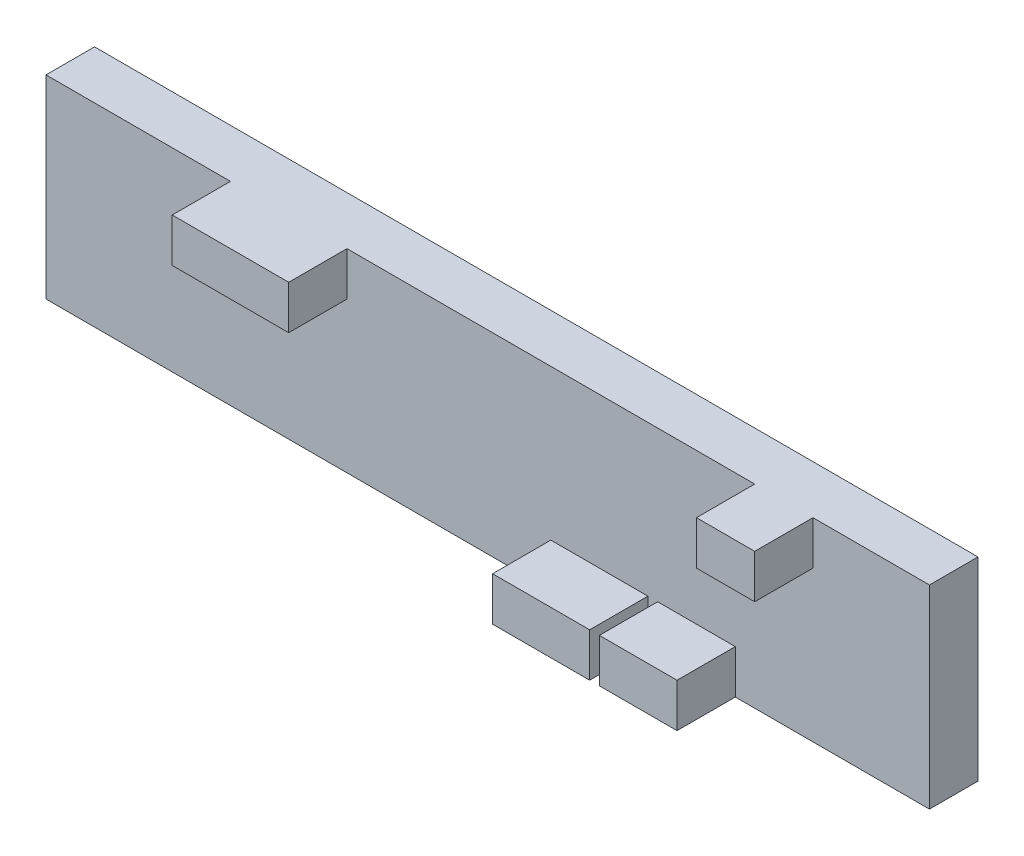
ISO-10303-21;
HEADER;
FILE_DESCRIPTION(('STEP AP214'),'2;1');
FILE_NAME('part.step','',(''),(''),'','','');
FILE_SCHEMA(('AUTOMOTIVE_DESIGN { 1 0 10303 214 1 1 1 1 }'));
ENDSEC;
DATA;
#1=APPLICATION_CONTEXT('core data for automotive mechanical design processes');
#2=APPLICATION_PROTOCOL_DEFINITION('international standard','automotive_design',2000,#1);
#3=PRODUCT_CONTEXT('',#1,'mechanical');
#4=PRODUCT('Part','Part','',(#3));
#5=PRODUCT_RELATED_PRODUCT_CATEGORY('part','',(#4));
#6=PRODUCT_DEFINITION_FORMATION('','',#4);
#7=PRODUCT_DEFINITION_CONTEXT('part definition',#1,'design');
#8=PRODUCT_DEFINITION('design','',#6,#7);
#9=PRODUCT_DEFINITION_SHAPE('','',#8);
#10=(LENGTH_UNIT() NAMED_UNIT(*) SI_UNIT(.MILLI.,.METRE.));
#11=(NAMED_UNIT(*) PLANE_ANGLE_UNIT() SI_UNIT($,.RADIAN.));
#12=(NAMED_UNIT(*) SI_UNIT($,.STERADIAN.) SOLID_ANGLE_UNIT());
#13=UNCERTAINTY_MEASURE_WITH_UNIT(LENGTH_MEASURE(1.E-05),#10,'distance_accuracy_value','');
#14=(GEOMETRIC_REPRESENTATION_CONTEXT(3) GLOBAL_UNCERTAINTY_ASSIGNED_CONTEXT((#13)) GLOBAL_UNIT_ASSIGNED_CONTEXT((#10,
#11,#12)) REPRESENTATION_CONTEXT('',''));
#15=CARTESIAN_POINT('',(0.,0.,0.));
#16=DIRECTION('',(0.,0.,1.));
#17=DIRECTION('',(1.,0.,0.));
#18=AXIS2_PLACEMENT_3D('',#15,#16,#17);
#19=CARTESIAN_POINT('',(0.,0.,5.));
#20=DIRECTION('',(0.,0.,1.));
#21=DIRECTION('',(1.,0.,0.));
#22=AXIS2_PLACEMENT_3D('',#19,#20,#21);
#23=PLANE('',#22);
#24=DIRECTION('',(1.,0.,0.));
#25=VECTOR('',#24,1.);
#26=CARTESIAN_POINT('',(0.,0.,5.));
#27=LINE('',#26,#25);
#28=CARTESIAN_POINT('',(62.,0.,5.));
#29=VERTEX_POINT('',#28);
#30=CARTESIAN_POINT('',(63.,0.,5.));
#31=VERTEX_POINT('',#30);
#32=EDGE_CURVE('E297',#29,#31,#27,.T.);
#33=ORIENTED_EDGE('',*,*,#32,.T.);
#34=DIRECTION('',(0.,-1.,0.));
#35=VECTOR('',#34,1.);
#36=CARTESIAN_POINT('',(63.,0.,5.));
#37=LINE('',#36,#35);
#38=CARTESIAN_POINT('',(63.,4.5,5.));
#39=VERTEX_POINT('',#38);
#40=EDGE_CURVE('E57',#39,#31,#37,.T.);
#41=ORIENTED_EDGE('',*,*,#40,.F.);
#42=DIRECTION('',(-1.,0.,0.));
#43=VECTOR('',#42,1.);
#44=CARTESIAN_POINT('',(63.,4.5,5.));
#45=LINE('',#44,#43);
#46=CARTESIAN_POINT('',(71.,4.5,5.));
#47=VERTEX_POINT('',#46);
#48=EDGE_CURVE('E52',#47,#39,#45,.T.);
#49=ORIENTED_EDGE('',*,*,#48,.F.);
#50=DIRECTION('',(0.,1.,0.));
#51=VECTOR('',#50,1.);
#52=CARTESIAN_POINT('',(71.,0.,5.));
#53=LINE('',#52,#51);
#54=CARTESIAN_POINT('',(71.,0.,5.));
#55=VERTEX_POINT('',#54);
#56=EDGE_CURVE('E524',#55,#47,#53,.T.);
#57=ORIENTED_EDGE('',*,*,#56,.F.);
#58=CARTESIAN_POINT('',(91.,0.,5.));
#59=VERTEX_POINT('',#58);
#60=EDGE_CURVE('E293',#55,#59,#27,.T.);
#61=ORIENTED_EDGE('',*,*,#60,.T.);
#62=DIRECTION('',(0.,1.,0.));
#63=VECTOR('',#62,1.);
#64=CARTESIAN_POINT('',(91.,0.,5.));
#65=LINE('',#64,#63);
#66=CARTESIAN_POINT('',(91.,20.,5.));
#67=VERTEX_POINT('',#66);
#68=EDGE_CURVE('E288',#59,#67,#65,.T.);
#69=ORIENTED_EDGE('',*,*,#68,.T.);
#70=DIRECTION('',(1.,0.,0.));
#71=VECTOR('',#70,1.);
#72=CARTESIAN_POINT('',(0.,20.,5.));
#73=LINE('',#72,#71);
#74=CARTESIAN_POINT('',(79.,20.,5.));
#75=VERTEX_POINT('',#74);
#76=EDGE_CURVE('E290',#75,#67,#73,.T.);
#77=ORIENTED_EDGE('',*,*,#76,.F.);
#78=DIRECTION('',(0.,1.,0.));
#79=VECTOR('',#78,1.);
#80=CARTESIAN_POINT('',(79.,20.,5.));
#81=LINE('',#80,#79);
#82=CARTESIAN_POINT('',(79.,15.5,5.));
#83=VERTEX_POINT('',#82);
#84=EDGE_CURVE('E233',#83,#75,#81,.T.);
#85=ORIENTED_EDGE('',*,*,#84,.F.);
#86=DIRECTION('',(1.,0.,0.));
#87=VECTOR('',#86,1.);
#88=CARTESIAN_POINT('',(73.,15.5,5.));
#89=LINE('',#88,#87);
#90=CARTESIAN_POINT('',(73.,15.5,5.));
#91=VERTEX_POINT('',#90);
#92=EDGE_CURVE('E242',#91,#83,#89,.T.);
#93=ORIENTED_EDGE('',*,*,#92,.F.);
#94=DIRECTION('',(0.,-1.,0.));
#95=VECTOR('',#94,1.);
#96=CARTESIAN_POINT('',(73.,20.,5.));
#97=LINE('',#96,#95);
#98=CARTESIAN_POINT('',(73.,20.,5.));
#99=VERTEX_POINT('',#98);
#100=EDGE_CURVE('E228',#99,#91,#97,.T.);
#101=ORIENTED_EDGE('',*,*,#100,.F.);
#102=CARTESIAN_POINT('',(31.,20.,5.));
#103=VERTEX_POINT('',#102);
#104=EDGE_CURVE('E289',#103,#99,#73,.T.);
#105=ORIENTED_EDGE('',*,*,#104,.F.);
#106=DIRECTION('',(0.,1.,0.));
#107=VECTOR('',#106,1.);
#108=CARTESIAN_POINT('',(31.,20.,5.));
#109=LINE('',#108,#107);
#110=CARTESIAN_POINT('',(31.,15.5,5.));
#111=VERTEX_POINT('',#110);
#112=EDGE_CURVE('E259',#111,#103,#109,.T.);
#113=ORIENTED_EDGE('',*,*,#112,.F.);
#114=DIRECTION('',(1.,0.,0.));
#115=VECTOR('',#114,1.);
#116=CARTESIAN_POINT('',(19.,15.5,5.));
#117=LINE('',#116,#115);
#118=CARTESIAN_POINT('',(19.,15.5,5.));
#119=VERTEX_POINT('',#118);
#120=EDGE_CURVE('E268',#119,#111,#117,.T.);
#121=ORIENTED_EDGE('',*,*,#120,.F.);
#122=DIRECTION('',(0.,-1.,0.));
#123=VECTOR('',#122,1.);
#124=CARTESIAN_POINT('',(19.,20.,5.));
#125=LINE('',#124,#123);
#126=CARTESIAN_POINT('',(19.,20.,5.));
#127=VERTEX_POINT('',#126);
#128=EDGE_CURVE('E254',#127,#119,#125,.T.);
#129=ORIENTED_EDGE('',*,*,#128,.F.);
#130=CARTESIAN_POINT('',(0.,20.,5.));
#131=VERTEX_POINT('',#130);
#132=EDGE_CURVE('E285',#131,#127,#73,.T.);
#133=ORIENTED_EDGE('',*,*,#132,.F.);
#134=DIRECTION('',(0.,1.,0.));
#135=VECTOR('',#134,1.);
#136=CARTESIAN_POINT('',(0.,0.,5.));
#137=LINE('',#136,#135);
#138=CARTESIAN_POINT('',(0.,0.,5.));
#139=VERTEX_POINT('',#138);
#140=EDGE_CURVE('E296',#139,#131,#137,.T.);
#141=ORIENTED_EDGE('',*,*,#140,.F.);
#142=CARTESIAN_POINT('',(52.,0.,5.));
#143=VERTEX_POINT('',#142);
#144=EDGE_CURVE('E294',#139,#143,#27,.T.);
#145=ORIENTED_EDGE('',*,*,#144,.T.);
#146=DIRECTION('',(0.,-1.,0.));
#147=VECTOR('',#146,1.);
#148=CARTESIAN_POINT('',(52.,0.,5.));
#149=LINE('',#148,#147);
#150=CARTESIAN_POINT('',(52.,4.5,5.));
#151=VERTEX_POINT('',#150);
#152=EDGE_CURVE('E193',#151,#143,#149,.T.);
#153=ORIENTED_EDGE('',*,*,#152,.F.);
#154=DIRECTION('',(-1.,0.,0.));
#155=VECTOR('',#154,1.);
#156=CARTESIAN_POINT('',(52.,4.5,5.));
#157=LINE('',#156,#155);
#158=CARTESIAN_POINT('',(62.,4.5,5.));
#159=VERTEX_POINT('',#158);
#160=EDGE_CURVE('E206',#159,#151,#157,.T.);
#161=ORIENTED_EDGE('',*,*,#160,.F.);
#162=DIRECTION('',(0.,1.,0.));
#163=VECTOR('',#162,1.);
#164=CARTESIAN_POINT('',(62.,0.,5.));
#165=LINE('',#164,#163);
#166=EDGE_CURVE('E196',#29,#159,#165,.T.);
#167=ORIENTED_EDGE('',*,*,#166,.F.);
#168=EDGE_LOOP('',(#33,#41,#49,#57,#61,#69,#77,#85,#93,#101,#105,#113,#121,#129,#133,#141,#145,
#153,#161,#167));
#169=FACE_BOUND('',#168,.T.);
#170=ADVANCED_FACE('F35',(#169),#23,.T.);
#171=CARTESIAN_POINT('',(0.,20.,5.));
#172=DIRECTION('',(0.,1.,0.));
#173=DIRECTION('',(0.,0.,1.));
#174=AXIS2_PLACEMENT_3D('',#171,#172,#173);
#175=PLANE('',#174);
#176=DIRECTION('',(1.,0.,0.));
#177=VECTOR('',#176,1.);
#178=CARTESIAN_POINT('',(0.,20.,0.));
#179=LINE('',#178,#177);
#180=CARTESIAN_POINT('',(0.,20.,0.));
#181=VERTEX_POINT('',#180);
#182=CARTESIAN_POINT('',(91.,20.,0.));
#183=VERTEX_POINT('',#182);
#184=EDGE_CURVE('E284',#181,#183,#179,.T.);
#185=ORIENTED_EDGE('',*,*,#184,.F.);
#186=DIRECTION('',(0.,0.,-1.));
#187=VECTOR('',#186,1.);
#188=CARTESIAN_POINT('',(0.,20.,5.));
#189=LINE('',#188,#187);
#190=EDGE_CURVE('E11',#131,#181,#189,.T.);
#191=ORIENTED_EDGE('',*,*,#190,.F.);
#192=ORIENTED_EDGE('',*,*,#132,.T.);
#193=DIRECTION('',(0.,0.,-1.));
#194=VECTOR('',#193,1.);
#195=CARTESIAN_POINT('',(19.,20.,11.));
#196=LINE('',#195,#194);
#197=CARTESIAN_POINT('',(19.,20.,11.));
#198=VERTEX_POINT('',#197);
#199=EDGE_CURVE('E265',#198,#127,#196,.T.);
#200=ORIENTED_EDGE('',*,*,#199,.F.);
#201=DIRECTION('',(-1.,0.,0.));
#202=VECTOR('',#201,1.);
#203=CARTESIAN_POINT('',(19.,20.,11.));
#204=LINE('',#203,#202);
#205=CARTESIAN_POINT('',(31.,20.,11.));
#206=VERTEX_POINT('',#205);
#207=EDGE_CURVE('E263',#206,#198,#204,.T.);
#208=ORIENTED_EDGE('',*,*,#207,.F.);
#209=DIRECTION('',(0.,0.,-1.));
#210=VECTOR('',#209,1.);
#211=CARTESIAN_POINT('',(31.,20.,11.));
#212=LINE('',#211,#210);
#213=EDGE_CURVE('E275',#206,#103,#212,.T.);
#214=ORIENTED_EDGE('',*,*,#213,.T.);
#215=ORIENTED_EDGE('',*,*,#104,.T.);
#216=DIRECTION('',(0.,0.,-1.));
#217=VECTOR('',#216,1.);
#218=CARTESIAN_POINT('',(73.,20.,11.));
#219=LINE('',#218,#217);
#220=CARTESIAN_POINT('',(73.,20.,11.));
#221=VERTEX_POINT('',#220);
#222=EDGE_CURVE('E239',#221,#99,#219,.T.);
#223=ORIENTED_EDGE('',*,*,#222,.F.);
#224=DIRECTION('',(-1.,0.,0.));
#225=VECTOR('',#224,1.);
#226=CARTESIAN_POINT('',(73.,20.,11.));
#227=LINE('',#226,#225);
#228=CARTESIAN_POINT('',(79.,20.,11.));
#229=VERTEX_POINT('',#228);
#230=EDGE_CURVE('E237',#229,#221,#227,.T.);
#231=ORIENTED_EDGE('',*,*,#230,.F.);
#232=DIRECTION('',(0.,0.,-1.));
#233=VECTOR('',#232,1.);
#234=CARTESIAN_POINT('',(79.,20.,11.));
#235=LINE('',#234,#233);
#236=EDGE_CURVE('E247',#229,#75,#235,.T.);
#237=ORIENTED_EDGE('',*,*,#236,.T.);
#238=ORIENTED_EDGE('',*,*,#76,.T.);
#239=DIRECTION('',(0.,0.,-1.));
#240=VECTOR('',#239,1.);
#241=CARTESIAN_POINT('',(91.,20.,5.));
#242=LINE('',#241,#240);
#243=EDGE_CURVE('E39',#67,#183,#242,.T.);
#244=ORIENTED_EDGE('',*,*,#243,.T.);
#245=EDGE_LOOP('',(#185,#191,#192,#200,#208,#214,#215,#223,#231,#237,#238,#244));
#246=FACE_BOUND('',#245,.T.);
#247=ADVANCED_FACE('F37',(#246),#175,.T.);
#248=CARTESIAN_POINT('',(0.,0.,5.));
#249=DIRECTION('',(-1.,0.,0.));
#250=DIRECTION('',(0.,0.,1.));
#251=AXIS2_PLACEMENT_3D('',#248,#249,#250);
#252=PLANE('',#251);
#253=DIRECTION('',(0.,1.,0.));
#254=VECTOR('',#253,1.);
#255=CARTESIAN_POINT('',(0.,0.,0.));
#256=LINE('',#255,#254);
#257=CARTESIAN_POINT('',(0.,0.,0.));
#258=VERTEX_POINT('',#257);
#259=EDGE_CURVE('E307',#258,#181,#256,.T.);
#260=ORIENTED_EDGE('',*,*,#259,.F.);
#261=DIRECTION('',(0.,0.,-1.));
#262=VECTOR('',#261,1.);
#263=CARTESIAN_POINT('',(0.,0.,5.));
#264=LINE('',#263,#262);
#265=EDGE_CURVE('E44',#139,#258,#264,.T.);
#266=ORIENTED_EDGE('',*,*,#265,.F.);
#267=ORIENTED_EDGE('',*,*,#140,.T.);
#268=ORIENTED_EDGE('',*,*,#190,.T.);
#269=EDGE_LOOP('',(#260,#266,#267,#268));
#270=FACE_BOUND('',#269,.T.);
#271=ADVANCED_FACE('F326',(#270),#252,.T.);
#272=CARTESIAN_POINT('',(0.,0.,5.));
#273=DIRECTION('',(0.,1.,0.));
#274=DIRECTION('',(0.,0.,1.));
#275=AXIS2_PLACEMENT_3D('',#272,#273,#274);
#276=PLANE('',#275);
#277=DIRECTION('',(1.,0.,0.));
#278=VECTOR('',#277,1.);
#279=CARTESIAN_POINT('',(0.,0.,0.));
#280=LINE('',#279,#278);
#281=CARTESIAN_POINT('',(91.,0.,0.));
#282=VERTEX_POINT('',#281);
#283=EDGE_CURVE('E305',#258,#282,#280,.T.);
#284=ORIENTED_EDGE('',*,*,#283,.T.);
#285=DIRECTION('',(0.,0.,-1.));
#286=VECTOR('',#285,1.);
#287=CARTESIAN_POINT('',(91.,0.,5.));
#288=LINE('',#287,#286);
#289=EDGE_CURVE('E310',#59,#282,#288,.T.);
#290=ORIENTED_EDGE('',*,*,#289,.F.);
#291=ORIENTED_EDGE('',*,*,#60,.F.);
#292=DIRECTION('',(0.,0.,-1.));
#293=VECTOR('',#292,1.);
#294=CARTESIAN_POINT('',(71.,0.,11.));
#295=LINE('',#294,#293);
#296=CARTESIAN_POINT('',(71.,0.,11.));
#297=VERTEX_POINT('',#296);
#298=EDGE_CURVE('E178',#297,#55,#295,.T.);
#299=ORIENTED_EDGE('',*,*,#298,.F.);
#300=DIRECTION('',(1.,0.,0.));
#301=VECTOR('',#300,1.);
#302=CARTESIAN_POINT('',(63.,0.,11.));
#303=LINE('',#302,#301);
#304=CARTESIAN_POINT('',(63.,0.,11.));
#305=VERTEX_POINT('',#304);
#306=EDGE_CURVE('E172',#305,#297,#303,.T.);
#307=ORIENTED_EDGE('',*,*,#306,.F.);
#308=DIRECTION('',(0.,0.,-1.));
#309=VECTOR('',#308,1.);
#310=CARTESIAN_POINT('',(63.,0.,11.));
#311=LINE('',#310,#309);
#312=EDGE_CURVE('E176',#305,#31,#311,.T.);
#313=ORIENTED_EDGE('',*,*,#312,.T.);
#314=ORIENTED_EDGE('',*,*,#32,.F.);
#315=DIRECTION('',(0.,0.,-1.));
#316=VECTOR('',#315,1.);
#317=CARTESIAN_POINT('',(62.,0.,11.));
#318=LINE('',#317,#316);
#319=CARTESIAN_POINT('',(62.,0.,11.));
#320=VERTEX_POINT('',#319);
#321=EDGE_CURVE('E222',#320,#29,#318,.T.);
#322=ORIENTED_EDGE('',*,*,#321,.F.);
#323=DIRECTION('',(1.,0.,0.));
#324=VECTOR('',#323,1.);
#325=CARTESIAN_POINT('',(52.,0.,11.));
#326=LINE('',#325,#324);
#327=CARTESIAN_POINT('',(52.,0.,11.));
#328=VERTEX_POINT('',#327);
#329=EDGE_CURVE('E205',#328,#320,#326,.T.);
#330=ORIENTED_EDGE('',*,*,#329,.F.);
#331=DIRECTION('',(0.,0.,-1.));
#332=VECTOR('',#331,1.);
#333=CARTESIAN_POINT('',(52.,0.,11.));
#334=LINE('',#333,#332);
#335=EDGE_CURVE('E225',#328,#143,#334,.T.);
#336=ORIENTED_EDGE('',*,*,#335,.T.);
#337=ORIENTED_EDGE('',*,*,#144,.F.);
#338=ORIENTED_EDGE('',*,*,#265,.T.);
#339=EDGE_LOOP('',(#284,#290,#291,#299,#307,#313,#314,#322,#330,#336,#337,#338));
#340=FACE_BOUND('',#339,.T.);
#341=ADVANCED_FACE('F174',(#340),#276,.F.);
#342=CARTESIAN_POINT('',(91.,0.,5.));
#343=DIRECTION('',(-1.,0.,0.));
#344=DIRECTION('',(0.,0.,1.));
#345=AXIS2_PLACEMENT_3D('',#342,#343,#344);
#346=PLANE('',#345);
#347=DIRECTION('',(0.,1.,0.));
#348=VECTOR('',#347,1.);
#349=CARTESIAN_POINT('',(91.,0.,0.));
#350=LINE('',#349,#348);
#351=EDGE_CURVE('E302',#282,#183,#350,.T.);
#352=ORIENTED_EDGE('',*,*,#351,.T.);
#353=ORIENTED_EDGE('',*,*,#243,.F.);
#354=ORIENTED_EDGE('',*,*,#68,.F.);
#355=ORIENTED_EDGE('',*,*,#289,.T.);
#356=EDGE_LOOP('',(#352,#353,#354,#355));
#357=FACE_BOUND('',#356,.T.);
#358=ADVANCED_FACE('F320',(#357),#346,.F.);
#359=CARTESIAN_POINT('',(0.,0.,0.));
#360=DIRECTION('',(0.,0.,1.));
#361=DIRECTION('',(1.,0.,0.));
#362=AXIS2_PLACEMENT_3D('',#359,#360,#361);
#363=PLANE('',#362);
#364=ORIENTED_EDGE('',*,*,#184,.T.);
#365=ORIENTED_EDGE('',*,*,#351,.F.);
#366=ORIENTED_EDGE('',*,*,#283,.F.);
#367=ORIENTED_EDGE('',*,*,#259,.T.);
#368=EDGE_LOOP('',(#364,#365,#366,#367));
#369=FACE_BOUND('',#368,.T.);
#370=ADVANCED_FACE('F323',(#369),#363,.F.);
#371=CARTESIAN_POINT('',(19.,20.,11.));
#372=DIRECTION('',(1.,0.,0.));
#373=DIRECTION('',(0.,0.,-1.));
#374=AXIS2_PLACEMENT_3D('',#371,#372,#373);
#375=PLANE('',#374);
#376=ORIENTED_EDGE('',*,*,#128,.T.);
#377=DIRECTION('',(0.,0.,-1.));
#378=VECTOR('',#377,1.);
#379=CARTESIAN_POINT('',(19.,15.5,11.));
#380=LINE('',#379,#378);
#381=CARTESIAN_POINT('',(19.,15.5,11.));
#382=VERTEX_POINT('',#381);
#383=EDGE_CURVE('E281',#382,#119,#380,.T.);
#384=ORIENTED_EDGE('',*,*,#383,.F.);
#385=DIRECTION('',(0.,-1.,0.));
#386=VECTOR('',#385,1.);
#387=CARTESIAN_POINT('',(19.,20.,11.));
#388=LINE('',#387,#386);
#389=EDGE_CURVE('E255',#198,#382,#388,.T.);
#390=ORIENTED_EDGE('',*,*,#389,.F.);
#391=ORIENTED_EDGE('',*,*,#199,.T.);
#392=EDGE_LOOP('',(#376,#384,#390,#391));
#393=FACE_BOUND('',#392,.T.);
#394=ADVANCED_FACE('F333',(#393),#375,.F.);
#395=CARTESIAN_POINT('',(19.,15.5,11.));
#396=DIRECTION('',(0.,1.,0.));
#397=DIRECTION('',(0.,0.,1.));
#398=AXIS2_PLACEMENT_3D('',#395,#396,#397);
#399=PLANE('',#398);
#400=ORIENTED_EDGE('',*,*,#120,.T.);
#401=DIRECTION('',(0.,0.,-1.));
#402=VECTOR('',#401,1.);
#403=CARTESIAN_POINT('',(31.,15.5,11.));
#404=LINE('',#403,#402);
#405=CARTESIAN_POINT('',(31.,15.5,11.));
#406=VERTEX_POINT('',#405);
#407=EDGE_CURVE('E278',#406,#111,#404,.T.);
#408=ORIENTED_EDGE('',*,*,#407,.F.);
#409=DIRECTION('',(1.,0.,0.));
#410=VECTOR('',#409,1.);
#411=CARTESIAN_POINT('',(19.,15.5,11.));
#412=LINE('',#411,#410);
#413=EDGE_CURVE('E258',#382,#406,#412,.T.);
#414=ORIENTED_EDGE('',*,*,#413,.F.);
#415=ORIENTED_EDGE('',*,*,#383,.T.);
#416=EDGE_LOOP('',(#400,#408,#414,#415));
#417=FACE_BOUND('',#416,.T.);
#418=ADVANCED_FACE('F346',(#417),#399,.F.);
#419=CARTESIAN_POINT('',(31.,20.,11.));
#420=DIRECTION('',(-1.,0.,0.));
#421=DIRECTION('',(0.,0.,1.));
#422=AXIS2_PLACEMENT_3D('',#419,#420,#421);
#423=PLANE('',#422);
#424=ORIENTED_EDGE('',*,*,#112,.T.);
#425=ORIENTED_EDGE('',*,*,#213,.F.);
#426=DIRECTION('',(0.,1.,0.));
#427=VECTOR('',#426,1.);
#428=CARTESIAN_POINT('',(31.,20.,11.));
#429=LINE('',#428,#427);
#430=EDGE_CURVE('E261',#406,#206,#429,.T.);
#431=ORIENTED_EDGE('',*,*,#430,.F.);
#432=ORIENTED_EDGE('',*,*,#407,.T.);
#433=EDGE_LOOP('',(#424,#425,#431,#432));
#434=FACE_BOUND('',#433,.T.);
#435=ADVANCED_FACE('F343',(#434),#423,.F.);
#436=CARTESIAN_POINT('',(0.,0.,11.));
#437=DIRECTION('',(0.,0.,1.));
#438=DIRECTION('',(1.,0.,0.));
#439=AXIS2_PLACEMENT_3D('',#436,#437,#438);
#440=PLANE('',#439);
#441=ORIENTED_EDGE('',*,*,#389,.T.);
#442=ORIENTED_EDGE('',*,*,#413,.T.);
#443=ORIENTED_EDGE('',*,*,#430,.T.);
#444=ORIENTED_EDGE('',*,*,#207,.T.);
#445=EDGE_LOOP('',(#441,#442,#443,#444));
#446=FACE_BOUND('',#445,.T.);
#447=ADVANCED_FACE('F339',(#446),#440,.T.);
#448=CARTESIAN_POINT('',(73.,20.,11.));
#449=DIRECTION('',(1.,0.,0.));
#450=DIRECTION('',(0.,0.,-1.));
#451=AXIS2_PLACEMENT_3D('',#448,#449,#450);
#452=PLANE('',#451);
#453=ORIENTED_EDGE('',*,*,#100,.T.);
#454=DIRECTION('',(0.,0.,-1.));
#455=VECTOR('',#454,1.);
#456=CARTESIAN_POINT('',(73.,15.5,11.));
#457=LINE('',#456,#455);
#458=CARTESIAN_POINT('',(73.,15.5,11.));
#459=VERTEX_POINT('',#458);
#460=EDGE_CURVE('E252',#459,#91,#457,.T.);
#461=ORIENTED_EDGE('',*,*,#460,.F.);
#462=DIRECTION('',(0.,-1.,0.));
#463=VECTOR('',#462,1.);
#464=CARTESIAN_POINT('',(73.,20.,11.));
#465=LINE('',#464,#463);
#466=EDGE_CURVE('E229',#221,#459,#465,.T.);
#467=ORIENTED_EDGE('',*,*,#466,.F.);
#468=ORIENTED_EDGE('',*,*,#222,.T.);
#469=EDGE_LOOP('',(#453,#461,#467,#468));
#470=FACE_BOUND('',#469,.T.);
#471=ADVANCED_FACE('F402',(#470),#452,.F.);
#472=CARTESIAN_POINT('',(73.,15.5,11.));
#473=DIRECTION('',(0.,1.,0.));
#474=DIRECTION('',(0.,0.,1.));
#475=AXIS2_PLACEMENT_3D('',#472,#473,#474);
#476=PLANE('',#475);
#477=ORIENTED_EDGE('',*,*,#92,.T.);
#478=DIRECTION('',(0.,0.,-1.));
#479=VECTOR('',#478,1.);
#480=CARTESIAN_POINT('',(79.,15.5,11.));
#481=LINE('',#480,#479);
#482=CARTESIAN_POINT('',(79.,15.5,11.));
#483=VERTEX_POINT('',#482);
#484=EDGE_CURVE('E249',#483,#83,#481,.T.);
#485=ORIENTED_EDGE('',*,*,#484,.F.);
#486=DIRECTION('',(1.,0.,0.));
#487=VECTOR('',#486,1.);
#488=CARTESIAN_POINT('',(73.,15.5,11.));
#489=LINE('',#488,#487);
#490=EDGE_CURVE('E232',#459,#483,#489,.T.);
#491=ORIENTED_EDGE('',*,*,#490,.F.);
#492=ORIENTED_EDGE('',*,*,#460,.T.);
#493=EDGE_LOOP('',(#477,#485,#491,#492));
#494=FACE_BOUND('',#493,.T.);
#495=ADVANCED_FACE('F411',(#494),#476,.F.);
#496=CARTESIAN_POINT('',(79.,20.,11.));
#497=DIRECTION('',(-1.,0.,0.));
#498=DIRECTION('',(0.,0.,1.));
#499=AXIS2_PLACEMENT_3D('',#496,#497,#498);
#500=PLANE('',#499);
#501=ORIENTED_EDGE('',*,*,#84,.T.);
#502=ORIENTED_EDGE('',*,*,#236,.F.);
#503=DIRECTION('',(0.,1.,0.));
#504=VECTOR('',#503,1.);
#505=CARTESIAN_POINT('',(79.,20.,11.));
#506=LINE('',#505,#504);
#507=EDGE_CURVE('E235',#483,#229,#506,.T.);
#508=ORIENTED_EDGE('',*,*,#507,.F.);
#509=ORIENTED_EDGE('',*,*,#484,.T.);
#510=EDGE_LOOP('',(#501,#502,#508,#509));
#511=FACE_BOUND('',#510,.T.);
#512=ADVANCED_FACE('F421',(#511),#500,.F.);
#513=CARTESIAN_POINT('',(0.,0.,11.));
#514=DIRECTION('',(0.,0.,1.));
#515=DIRECTION('',(1.,0.,0.));
#516=AXIS2_PLACEMENT_3D('',#513,#514,#515);
#517=PLANE('',#516);
#518=ORIENTED_EDGE('',*,*,#466,.T.);
#519=ORIENTED_EDGE('',*,*,#490,.T.);
#520=ORIENTED_EDGE('',*,*,#507,.T.);
#521=ORIENTED_EDGE('',*,*,#230,.T.);
#522=EDGE_LOOP('',(#518,#519,#520,#521));
#523=FACE_BOUND('',#522,.T.);
#524=ADVANCED_FACE('F431',(#523),#517,.T.);
#525=CARTESIAN_POINT('',(52.,0.,11.));
#526=DIRECTION('',(1.,0.,0.));
#527=DIRECTION('',(0.,0.,-1.));
#528=AXIS2_PLACEMENT_3D('',#525,#526,#527);
#529=PLANE('',#528);
#530=ORIENTED_EDGE('',*,*,#152,.T.);
#531=ORIENTED_EDGE('',*,*,#335,.F.);
#532=DIRECTION('',(0.,-1.,0.));
#533=VECTOR('',#532,1.);
#534=CARTESIAN_POINT('',(52.,0.,11.));
#535=LINE('',#534,#533);
#536=CARTESIAN_POINT('',(52.,4.5,11.));
#537=VERTEX_POINT('',#536);
#538=EDGE_CURVE('E202',#537,#328,#535,.T.);
#539=ORIENTED_EDGE('',*,*,#538,.F.);
#540=DIRECTION('',(0.,0.,-1.));
#541=VECTOR('',#540,1.);
#542=CARTESIAN_POINT('',(52.,4.5,11.));
#543=LINE('',#542,#541);
#544=EDGE_CURVE('E211',#537,#151,#543,.T.);
#545=ORIENTED_EDGE('',*,*,#544,.T.);
#546=EDGE_LOOP('',(#530,#531,#539,#545));
#547=FACE_BOUND('',#546,.T.);
#548=ADVANCED_FACE('F441',(#547),#529,.F.);
#549=CARTESIAN_POINT('',(62.,0.,11.));
#550=DIRECTION('',(-1.,0.,0.));
#551=DIRECTION('',(0.,0.,1.));
#552=AXIS2_PLACEMENT_3D('',#549,#550,#551);
#553=PLANE('',#552);
#554=ORIENTED_EDGE('',*,*,#166,.T.);
#555=DIRECTION('',(0.,0.,-1.));
#556=VECTOR('',#555,1.);
#557=CARTESIAN_POINT('',(62.,4.5,11.));
#558=LINE('',#557,#556);
#559=CARTESIAN_POINT('',(62.,4.5,11.));
#560=VERTEX_POINT('',#559);
#561=EDGE_CURVE('E219',#560,#159,#558,.T.);
#562=ORIENTED_EDGE('',*,*,#561,.F.);
#563=DIRECTION('',(0.,1.,0.));
#564=VECTOR('',#563,1.);
#565=CARTESIAN_POINT('',(62.,0.,11.));
#566=LINE('',#565,#564);
#567=EDGE_CURVE('E208',#320,#560,#566,.T.);
#568=ORIENTED_EDGE('',*,*,#567,.F.);
#569=ORIENTED_EDGE('',*,*,#321,.T.);
#570=EDGE_LOOP('',(#554,#562,#568,#569));
#571=FACE_BOUND('',#570,.T.);
#572=ADVANCED_FACE('F451',(#571),#553,.F.);
#573=CARTESIAN_POINT('',(52.,4.5,11.));
#574=DIRECTION('',(0.,-1.,0.));
#575=DIRECTION('',(0.,0.,-1.));
#576=AXIS2_PLACEMENT_3D('',#573,#574,#575);
#577=PLANE('',#576);
#578=ORIENTED_EDGE('',*,*,#160,.T.);
#579=ORIENTED_EDGE('',*,*,#544,.F.);
#580=DIRECTION('',(-1.,0.,0.));
#581=VECTOR('',#580,1.);
#582=CARTESIAN_POINT('',(52.,4.5,11.));
#583=LINE('',#582,#581);
#584=EDGE_CURVE('E210',#560,#537,#583,.T.);
#585=ORIENTED_EDGE('',*,*,#584,.F.);
#586=ORIENTED_EDGE('',*,*,#561,.T.);
#587=EDGE_LOOP('',(#578,#579,#585,#586));
#588=FACE_BOUND('',#587,.T.);
#589=ADVANCED_FACE('F461',(#588),#577,.F.);
#590=CARTESIAN_POINT('',(0.,0.,11.));
#591=DIRECTION('',(0.,0.,-1.));
#592=DIRECTION('',(-1.,0.,0.));
#593=AXIS2_PLACEMENT_3D('',#590,#591,#592);
#594=PLANE('',#593);
#595=ORIENTED_EDGE('',*,*,#538,.T.);
#596=ORIENTED_EDGE('',*,*,#329,.T.);
#597=ORIENTED_EDGE('',*,*,#567,.T.);
#598=ORIENTED_EDGE('',*,*,#584,.T.);
#599=EDGE_LOOP('',(#595,#596,#597,#598));
#600=FACE_BOUND('',#599,.T.);
#601=ADVANCED_FACE('F471',(#600),#594,.F.);
#602=CARTESIAN_POINT('',(63.,0.,11.));
#603=DIRECTION('',(1.,0.,0.));
#604=DIRECTION('',(0.,0.,-1.));
#605=AXIS2_PLACEMENT_3D('',#602,#603,#604);
#606=PLANE('',#605);
#607=ORIENTED_EDGE('',*,*,#40,.T.);
#608=ORIENTED_EDGE('',*,*,#312,.F.);
#609=DIRECTION('',(0.,-1.,0.));
#610=VECTOR('',#609,1.);
#611=CARTESIAN_POINT('',(63.,0.,11.));
#612=LINE('',#611,#610);
#613=CARTESIAN_POINT('',(63.,4.5,11.));
#614=VERTEX_POINT('',#613);
#615=EDGE_CURVE('E182',#614,#305,#612,.T.);
#616=ORIENTED_EDGE('',*,*,#615,.F.);
#617=DIRECTION('',(0.,0.,-1.));
#618=VECTOR('',#617,1.);
#619=CARTESIAN_POINT('',(63.,4.5,11.));
#620=LINE('',#619,#618);
#621=EDGE_CURVE('E522',#614,#39,#620,.T.);
#622=ORIENTED_EDGE('',*,*,#621,.T.);
#623=EDGE_LOOP('',(#607,#608,#616,#622));
#624=FACE_BOUND('',#623,.T.);
#625=ADVANCED_FACE('F192',(#624),#606,.F.);
#626=CARTESIAN_POINT('',(71.,0.,11.));
#627=DIRECTION('',(-1.,0.,0.));
#628=DIRECTION('',(0.,0.,1.));
#629=AXIS2_PLACEMENT_3D('',#626,#627,#628);
#630=PLANE('',#629);
#631=ORIENTED_EDGE('',*,*,#56,.T.);
#632=DIRECTION('',(0.,0.,-1.));
#633=VECTOR('',#632,1.);
#634=CARTESIAN_POINT('',(71.,4.5,11.));
#635=LINE('',#634,#633);
#636=CARTESIAN_POINT('',(71.,4.5,11.));
#637=VERTEX_POINT('',#636);
#638=EDGE_CURVE('E198',#637,#47,#635,.T.);
#639=ORIENTED_EDGE('',*,*,#638,.F.);
#640=DIRECTION('',(0.,1.,0.));
#641=VECTOR('',#640,1.);
#642=CARTESIAN_POINT('',(71.,0.,11.));
#643=LINE('',#642,#641);
#644=EDGE_CURVE('E181',#297,#637,#643,.T.);
#645=ORIENTED_EDGE('',*,*,#644,.F.);
#646=ORIENTED_EDGE('',*,*,#298,.T.);
#647=EDGE_LOOP('',(#631,#639,#645,#646));
#648=FACE_BOUND('',#647,.T.);
#649=ADVANCED_FACE('F490',(#648),#630,.F.);
#650=CARTESIAN_POINT('',(63.,4.5,11.));
#651=DIRECTION('',(0.,-1.,0.));
#652=DIRECTION('',(0.,0.,-1.));
#653=AXIS2_PLACEMENT_3D('',#650,#651,#652);
#654=PLANE('',#653);
#655=ORIENTED_EDGE('',*,*,#48,.T.);
#656=ORIENTED_EDGE('',*,*,#621,.F.);
#657=DIRECTION('',(-1.,0.,0.));
#658=VECTOR('',#657,1.);
#659=CARTESIAN_POINT('',(63.,4.5,11.));
#660=LINE('',#659,#658);
#661=EDGE_CURVE('E187',#637,#614,#660,.T.);
#662=ORIENTED_EDGE('',*,*,#661,.F.);
#663=ORIENTED_EDGE('',*,*,#638,.T.);
#664=EDGE_LOOP('',(#655,#656,#662,#663));
#665=FACE_BOUND('',#664,.T.);
#666=ADVANCED_FACE('F499',(#665),#654,.F.);
#667=CARTESIAN_POINT('',(0.,0.,11.));
#668=DIRECTION('',(0.,0.,-1.));
#669=DIRECTION('',(-1.,0.,0.));
#670=AXIS2_PLACEMENT_3D('',#667,#668,#669);
#671=PLANE('',#670);
#672=ORIENTED_EDGE('',*,*,#615,.T.);
#673=ORIENTED_EDGE('',*,*,#306,.T.);
#674=ORIENTED_EDGE('',*,*,#644,.T.);
#675=ORIENTED_EDGE('',*,*,#661,.T.);
#676=EDGE_LOOP('',(#672,#673,#674,#675));
#677=FACE_BOUND('',#676,.T.);
#678=ADVANCED_FACE('F185',(#677),#671,.F.);
#679=CLOSED_SHELL('',(#170,#247,#271,#341,#358,#370,#394,#418,#435,#447,#471,#495,#512,#524,
#548,#572,#589,#601,#625,#649,#666,#678));
#680=MANIFOLD_SOLID_BREP('B2',#679);
#681=ADVANCED_BREP_SHAPE_REPRESENTATION('',(#18,#680),#14);
#682=SHAPE_DEFINITION_REPRESENTATION(#9,#681);
ENDSEC;
END-ISO-10303-21;
